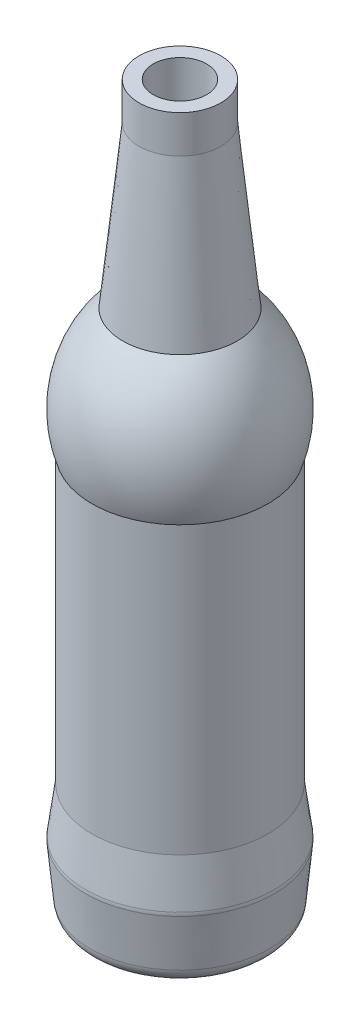
ISO-10303-21;
HEADER;
FILE_DESCRIPTION(('STEP AP214'),'2;1');
FILE_NAME('part.step','',(''),(''),'','','');
FILE_SCHEMA(('AUTOMOTIVE_DESIGN { 1 0 10303 214 1 1 1 1 }'));
ENDSEC;
DATA;
#1=APPLICATION_CONTEXT('core data for automotive mechanical design processes');
#2=APPLICATION_PROTOCOL_DEFINITION('international standard','automotive_design',2000,#1);
#3=PRODUCT_CONTEXT('',#1,'mechanical');
#4=PRODUCT('Part','Part','',(#3));
#5=PRODUCT_RELATED_PRODUCT_CATEGORY('part','',(#4));
#6=PRODUCT_DEFINITION_FORMATION('','',#4);
#7=PRODUCT_DEFINITION_CONTEXT('part definition',#1,'design');
#8=PRODUCT_DEFINITION('design','',#6,#7);
#9=PRODUCT_DEFINITION_SHAPE('','',#8);
#10=(LENGTH_UNIT() NAMED_UNIT(*) SI_UNIT(.MILLI.,.METRE.));
#11=(NAMED_UNIT(*) PLANE_ANGLE_UNIT() SI_UNIT($,.RADIAN.));
#12=(NAMED_UNIT(*) SI_UNIT($,.STERADIAN.) SOLID_ANGLE_UNIT());
#13=UNCERTAINTY_MEASURE_WITH_UNIT(LENGTH_MEASURE(1.E-05),#10,'distance_accuracy_value','');
#14=(GEOMETRIC_REPRESENTATION_CONTEXT(3) GLOBAL_UNCERTAINTY_ASSIGNED_CONTEXT((#13)) GLOBAL_UNIT_ASSIGNED_CONTEXT((#10,
#11,#12)) REPRESENTATION_CONTEXT('',''));
#15=CARTESIAN_POINT('',(0.,0.,0.));
#16=DIRECTION('',(0.,0.,1.));
#17=DIRECTION('',(1.,0.,0.));
#18=AXIS2_PLACEMENT_3D('',#15,#16,#17);
#19=CARTESIAN_POINT('',(0.,0.,0.));
#20=DIRECTION('',(0.,1.,0.));
#21=DIRECTION('',(0.,0.,1.));
#22=AXIS2_PLACEMENT_3D('',#19,#20,#21);
#23=PLANE('',#22);
#24=CARTESIAN_POINT('',(0.,0.,0.));
#25=DIRECTION('',(0.,-1.,0.));
#26=DIRECTION('',(0.,0.,-1.));
#27=AXIS2_PLACEMENT_3D('',#24,#25,#26);
#28=CIRCLE('',#27,23.453565926255);
#29=CARTESIAN_POINT('',(0.,0.,-23.453565926255));
#30=VERTEX_POINT('',#29);
#31=EDGE_CURVE('E10',#30,#30,#28,.T.);
#32=ORIENTED_EDGE('',*,*,#31,.T.);
#33=EDGE_LOOP('',(#32));
#34=FACE_BOUND('',#33,.T.);
#35=ADVANCED_FACE('F37',(#34),#23,.F.);
#36=CARTESIAN_POINT('',(0.,5.,0.));
#37=DIRECTION('',(0.,-1.,0.));
#38=DIRECTION('',(0.,0.,-1.));
#39=AXIS2_PLACEMENT_3D('',#36,#37,#38);
#40=TOROIDAL_SURFACE('',#39,23.453565926255,5.);
#41=ORIENTED_EDGE('',*,*,#31,.F.);
#42=EDGE_LOOP('',(#41));
#43=FACE_BOUND('',#42,.T.);
#44=CARTESIAN_POINT('',(0.,4.52595453686005,0.));
#45=DIRECTION('',(0.,-1.,0.));
#46=DIRECTION('',(0.,0.,-1.));
#47=AXIS2_PLACEMENT_3D('',#44,#45,#46);
#48=CIRCLE('',#47,28.4310432892248);
#49=CARTESIAN_POINT('',(0.,4.52595453686005,-28.4310432892248));
#50=VERTEX_POINT('',#49);
#51=EDGE_CURVE('E44',#50,#50,#48,.T.);
#52=ORIENTED_EDGE('',*,*,#51,.T.);
#53=EDGE_LOOP('',(#52));
#54=FACE_BOUND('',#53,.T.);
#55=ADVANCED_FACE('F129',(#43,#54),#40,.T.);
#56=CARTESIAN_POINT('',(0.,20.4313490984629,0.));
#57=DIRECTION('',(0.,1.,0.));
#58=DIRECTION('',(0.,0.,1.));
#59=AXIS2_PLACEMENT_3D('',#56,#57,#58);
#60=CONICAL_SURFACE('',#59,29.9458427712822,0.0949517063427563);
#61=ORIENTED_EDGE('',*,*,#51,.F.);
#62=EDGE_LOOP('',(#61));
#63=FACE_BOUND('',#62,.T.);
#64=CARTESIAN_POINT('',(0.,20.4313490984629,0.));
#65=DIRECTION('',(0.,-1.,0.));
#66=DIRECTION('',(0.,0.,-1.));
#67=AXIS2_PLACEMENT_3D('',#64,#65,#66);
#68=CIRCLE('',#67,29.9458427712822);
#69=CARTESIAN_POINT('',(0.,20.4313490984629,-29.9458427712822));
#70=VERTEX_POINT('',#69);
#71=EDGE_CURVE('E49',#70,#70,#68,.T.);
#72=ORIENTED_EDGE('',*,*,#71,.T.);
#73=EDGE_LOOP('',(#72));
#74=FACE_BOUND('',#73,.T.);
#75=ADVANCED_FACE('F133',(#63,#74),#60,.T.);
#76=CARTESIAN_POINT('',(0.,20.9053945616029,0.));
#77=DIRECTION('',(0.,-1.,0.));
#78=DIRECTION('',(0.,0.,-1.));
#79=AXIS2_PLACEMENT_3D('',#76,#77,#78);
#80=TOROIDAL_SURFACE('',#79,24.9683654083124,5.);
#81=ORIENTED_EDGE('',*,*,#71,.F.);
#82=EDGE_LOOP('',(#81));
#83=FACE_BOUND('',#82,.T.);
#84=CARTESIAN_POINT('',(0.,21.566213162058,0.));
#85=DIRECTION('',(0.,-1.,0.));
#86=DIRECTION('',(0.,0.,-1.));
#87=AXIS2_PLACEMENT_3D('',#84,#85,#86);
#88=CIRCLE('',#87,29.9245049117256);
#89=CARTESIAN_POINT('',(0.,21.566213162058,-29.9245049117256));
#90=VERTEX_POINT('',#89);
#91=EDGE_CURVE('E54',#90,#90,#88,.T.);
#92=ORIENTED_EDGE('',*,*,#91,.T.);
#93=EDGE_LOOP('',(#92));
#94=FACE_BOUND('',#93,.T.);
#95=ADVANCED_FACE('F138',(#83,#94),#80,.T.);
#96=CARTESIAN_POINT('',(0.,36.,0.));
#97=DIRECTION('',(0.,-1.,0.));
#98=DIRECTION('',(0.,0.,-1.));
#99=AXIS2_PLACEMENT_3D('',#96,#97,#98);
#100=CONICAL_SURFACE('',#99,28.,0.132551532296674);
#101=ORIENTED_EDGE('',*,*,#91,.F.);
#102=EDGE_LOOP('',(#101));
#103=FACE_BOUND('',#102,.T.);
#104=CARTESIAN_POINT('',(0.,36.,0.));
#105=DIRECTION('',(0.,-1.,0.));
#106=DIRECTION('',(0.,0.,-1.));
#107=AXIS2_PLACEMENT_3D('',#104,#105,#106);
#108=CIRCLE('',#107,28.);
#109=CARTESIAN_POINT('',(0.,36.,-28.));
#110=VERTEX_POINT('',#109);
#111=EDGE_CURVE('E60',#110,#110,#108,.T.);
#112=ORIENTED_EDGE('',*,*,#111,.T.);
#113=EDGE_LOOP('',(#112));
#114=FACE_BOUND('',#113,.T.);
#115=ADVANCED_FACE('F144',(#103,#114),#100,.T.);
#116=CARTESIAN_POINT('',(0.,0.,0.));
#117=DIRECTION('',(0.,-1.,0.));
#118=DIRECTION('',(0.,0.,-1.));
#119=AXIS2_PLACEMENT_3D('',#116,#117,#118);
#120=CYLINDRICAL_SURFACE('',#119,28.);
#121=ORIENTED_EDGE('',*,*,#111,.F.);
#122=EDGE_LOOP('',(#121));
#123=FACE_BOUND('',#122,.T.);
#124=CARTESIAN_POINT('',(0.,127.,0.));
#125=DIRECTION('',(0.,-1.,0.));
#126=DIRECTION('',(0.,0.,-1.));
#127=AXIS2_PLACEMENT_3D('',#124,#125,#126);
#128=CIRCLE('',#127,28.);
#129=CARTESIAN_POINT('',(0.,127.,-28.));
#130=VERTEX_POINT('',#129);
#131=EDGE_CURVE('E64',#130,#130,#128,.T.);
#132=ORIENTED_EDGE('',*,*,#131,.T.);
#133=EDGE_LOOP('',(#132));
#134=FACE_BOUND('',#133,.T.);
#135=ADVANCED_FACE('F148',(#123,#134),#120,.T.);
#136=CARTESIAN_POINT('',(0.,139.2650759235,0.));
#137=DIRECTION('',(0.,-1.,0.));
#138=DIRECTION('',(0.,0.,-1.));
#139=AXIS2_PLACEMENT_3D('',#136,#137,#138);
#140=DEGENERATE_TOROIDAL_SURFACE('',#139,8.60802185230658,38.6080218523066,.F.);
#141=ORIENTED_EDGE('',*,*,#131,.F.);
#142=EDGE_LOOP('',(#141));
#143=FACE_BOUND('',#142,.T.);
#144=CARTESIAN_POINT('',(0.,167.,0.));
#145=DIRECTION('',(0.,-1.,0.));
#146=DIRECTION('',(0.,0.,-1.));
#147=AXIS2_PLACEMENT_3D('',#144,#145,#146);
#148=CIRCLE('',#147,18.25);
#149=CARTESIAN_POINT('',(0.,167.,-18.25));
#150=VERTEX_POINT('',#149);
#151=EDGE_CURVE('E68',#150,#150,#148,.T.);
#152=ORIENTED_EDGE('',*,*,#151,.T.);
#153=EDGE_LOOP('',(#152));
#154=FACE_BOUND('',#153,.T.);
#155=ADVANCED_FACE('F152',(#143,#154),#140,.F.);
#156=CARTESIAN_POINT('',(0.,218.,0.));
#157=DIRECTION('',(0.,-1.,0.));
#158=DIRECTION('',(0.,0.,-1.));
#159=AXIS2_PLACEMENT_3D('',#156,#157,#158);
#160=CONICAL_SURFACE('',#159,13.,0.102579852418295);
#161=ORIENTED_EDGE('',*,*,#151,.F.);
#162=EDGE_LOOP('',(#161));
#163=FACE_BOUND('',#162,.T.);
#164=CARTESIAN_POINT('',(0.,218.,0.));
#165=DIRECTION('',(0.,-1.,0.));
#166=DIRECTION('',(0.,0.,-1.));
#167=AXIS2_PLACEMENT_3D('',#164,#165,#166);
#168=CIRCLE('',#167,13.);
#169=CARTESIAN_POINT('',(0.,218.,-13.));
#170=VERTEX_POINT('',#169);
#171=EDGE_CURVE('E72',#170,#170,#168,.T.);
#172=ORIENTED_EDGE('',*,*,#171,.T.);
#173=EDGE_LOOP('',(#172));
#174=FACE_BOUND('',#173,.T.);
#175=ADVANCED_FACE('F156',(#163,#174),#160,.T.);
#176=CARTESIAN_POINT('',(0.,0.,0.));
#177=DIRECTION('',(0.,-1.,0.));
#178=DIRECTION('',(0.,0.,-1.));
#179=AXIS2_PLACEMENT_3D('',#176,#177,#178);
#180=CYLINDRICAL_SURFACE('',#179,13.);
#181=ORIENTED_EDGE('',*,*,#171,.F.);
#182=EDGE_LOOP('',(#181));
#183=FACE_BOUND('',#182,.T.);
#184=CARTESIAN_POINT('',(0.,230.,0.));
#185=DIRECTION('',(0.,-1.,0.));
#186=DIRECTION('',(0.,0.,-1.));
#187=AXIS2_PLACEMENT_3D('',#184,#185,#186);
#188=CIRCLE('',#187,13.);
#189=CARTESIAN_POINT('',(0.,230.,-13.));
#190=VERTEX_POINT('',#189);
#191=EDGE_CURVE('E76',#190,#190,#188,.T.);
#192=ORIENTED_EDGE('',*,*,#191,.T.);
#193=EDGE_LOOP('',(#192));
#194=FACE_BOUND('',#193,.T.);
#195=ADVANCED_FACE('F160',(#183,#194),#180,.T.);
#196=CARTESIAN_POINT('',(-13.,230.,0.));
#197=DIRECTION('',(0.,-1.,0.));
#198=DIRECTION('',(0.,0.,-1.));
#199=AXIS2_PLACEMENT_3D('',#196,#197,#198);
#200=PLANE('',#199);
#201=ORIENTED_EDGE('',*,*,#191,.F.);
#202=EDGE_LOOP('',(#201));
#203=FACE_BOUND('',#202,.T.);
#204=CARTESIAN_POINT('',(0.,230.,0.));
#205=DIRECTION('',(0.,-1.,0.));
#206=DIRECTION('',(0.,0.,-1.));
#207=AXIS2_PLACEMENT_3D('',#204,#205,#206);
#208=CIRCLE('',#207,8.5);
#209=CARTESIAN_POINT('',(0.,230.,-8.5));
#210=VERTEX_POINT('',#209);
#211=EDGE_CURVE('E80',#210,#210,#208,.T.);
#212=ORIENTED_EDGE('',*,*,#211,.T.);
#213=EDGE_LOOP('',(#212));
#214=FACE_BOUND('',#213,.T.);
#215=ADVANCED_FACE('F164',(#203,#214),#200,.F.);
#216=CARTESIAN_POINT('',(0.,0.,0.));
#217=DIRECTION('',(0.,-1.,0.));
#218=DIRECTION('',(0.,0.,-1.));
#219=AXIS2_PLACEMENT_3D('',#216,#217,#218);
#220=CYLINDRICAL_SURFACE('',#219,8.5);
#221=ORIENTED_EDGE('',*,*,#211,.F.);
#222=EDGE_LOOP('',(#221));
#223=FACE_BOUND('',#222,.T.);
#224=CARTESIAN_POINT('',(0.,217.768992729596,0.));
#225=DIRECTION('',(0.,-1.,0.));
#226=DIRECTION('',(0.,0.,-1.));
#227=AXIS2_PLACEMENT_3D('',#224,#225,#226);
#228=CIRCLE('',#227,8.5);
#229=CARTESIAN_POINT('',(0.,217.768992729596,-8.5));
#230=VERTEX_POINT('',#229);
#231=EDGE_CURVE('E84',#230,#230,#228,.T.);
#232=ORIENTED_EDGE('',*,*,#231,.T.);
#233=EDGE_LOOP('',(#232));
#234=FACE_BOUND('',#233,.T.);
#235=ADVANCED_FACE('F168',(#223,#234),#220,.F.);
#236=CARTESIAN_POINT('',(0.,164.850328678312,0.));
#237=DIRECTION('',(0.,-1.,0.));
#238=DIRECTION('',(0.,0.,-1.));
#239=AXIS2_PLACEMENT_3D('',#236,#237,#238);
#240=CONICAL_SURFACE('',#239,13.947509534691,0.102579852418295);
#241=ORIENTED_EDGE('',*,*,#231,.F.);
#242=EDGE_LOOP('',(#241));
#243=FACE_BOUND('',#242,.T.);
#244=CARTESIAN_POINT('',(0.,164.850328678312,0.));
#245=DIRECTION('',(0.,-1.,0.));
#246=DIRECTION('',(0.,0.,-1.));
#247=AXIS2_PLACEMENT_3D('',#244,#245,#246);
#248=CIRCLE('',#247,13.947509534691);
#249=CARTESIAN_POINT('',(0.,164.850328678312,-13.947509534691));
#250=VERTEX_POINT('',#249);
#251=EDGE_CURVE('E88',#250,#250,#248,.T.);
#252=ORIENTED_EDGE('',*,*,#251,.T.);
#253=EDGE_LOOP('',(#252));
#254=FACE_BOUND('',#253,.T.);
#255=ADVANCED_FACE('F172',(#243,#254),#240,.F.);
#256=CARTESIAN_POINT('',(0.,139.2650759235,0.));
#257=DIRECTION('',(0.,-1.,0.));
#258=DIRECTION('',(0.,0.,-1.));
#259=AXIS2_PLACEMENT_3D('',#256,#257,#258);
#260=DEGENERATE_TOROIDAL_SURFACE('',#259,8.60802185230658,34.1080218523066,.F.);
#261=ORIENTED_EDGE('',*,*,#251,.F.);
#262=EDGE_LOOP('',(#261));
#263=FACE_BOUND('',#262,.T.);
#264=CARTESIAN_POINT('',(0.,127.757161802808,0.));
#265=DIRECTION('',(0.,-1.,0.));
#266=DIRECTION('',(0.,0.,-1.));
#267=AXIS2_PLACEMENT_3D('',#264,#265,#266);
#268=CIRCLE('',#267,23.5);
#269=CARTESIAN_POINT('',(0.,127.757161802808,-23.5));
#270=VERTEX_POINT('',#269);
#271=EDGE_CURVE('E92',#270,#270,#268,.T.);
#272=ORIENTED_EDGE('',*,*,#271,.T.);
#273=EDGE_LOOP('',(#272));
#274=FACE_BOUND('',#273,.T.);
#275=ADVANCED_FACE('F176',(#263,#274),#260,.T.);
#276=CARTESIAN_POINT('',(0.,0.,0.));
#277=DIRECTION('',(0.,-1.,0.));
#278=DIRECTION('',(0.,0.,-1.));
#279=AXIS2_PLACEMENT_3D('',#276,#277,#278);
#280=CYLINDRICAL_SURFACE('',#279,23.5);
#281=ORIENTED_EDGE('',*,*,#271,.F.);
#282=EDGE_LOOP('',(#281));
#283=FACE_BOUND('',#282,.T.);
#284=CARTESIAN_POINT('',(0.,35.7013216115515,0.));
#285=DIRECTION('',(0.,-1.,0.));
#286=DIRECTION('',(0.,0.,-1.));
#287=AXIS2_PLACEMENT_3D('',#284,#285,#286);
#288=CIRCLE('',#287,23.5);
#289=CARTESIAN_POINT('',(0.,35.7013216115515,-23.5));
#290=VERTEX_POINT('',#289);
#291=EDGE_CURVE('E96',#290,#290,#288,.T.);
#292=ORIENTED_EDGE('',*,*,#291,.T.);
#293=EDGE_LOOP('',(#292));
#294=FACE_BOUND('',#293,.T.);
#295=ADVANCED_FACE('F180',(#283,#294),#280,.F.);
#296=CARTESIAN_POINT('',(0.,20.9714764216484,0.));
#297=DIRECTION('',(0.,-1.,0.));
#298=DIRECTION('',(0.,0.,-1.));
#299=AXIS2_PLACEMENT_3D('',#296,#297,#298);
#300=CONICAL_SURFACE('',#299,25.4639793586537,0.132551532296674);
#301=ORIENTED_EDGE('',*,*,#291,.F.);
#302=EDGE_LOOP('',(#301));
#303=FACE_BOUND('',#302,.T.);
#304=CARTESIAN_POINT('',(0.,20.9714764216484,0.));
#305=DIRECTION('',(0.,-1.,0.));
#306=DIRECTION('',(0.,0.,-1.));
#307=AXIS2_PLACEMENT_3D('',#304,#305,#306);
#308=CIRCLE('',#307,25.4639793586537);
#309=CARTESIAN_POINT('',(0.,20.9714764216484,-25.4639793586537));
#310=VERTEX_POINT('',#309);
#311=EDGE_CURVE('E100',#310,#310,#308,.T.);
#312=ORIENTED_EDGE('',*,*,#311,.T.);
#313=EDGE_LOOP('',(#312));
#314=FACE_BOUND('',#313,.T.);
#315=ADVANCED_FACE('F184',(#303,#314),#300,.F.);
#316=CARTESIAN_POINT('',(0.,20.9053945616029,0.));
#317=DIRECTION('',(0.,-1.,0.));
#318=DIRECTION('',(0.,0.,-1.));
#319=AXIS2_PLACEMENT_3D('',#316,#317,#318);
#320=TOROIDAL_SURFACE('',#319,24.9683654083124,0.500000000000001);
#321=ORIENTED_EDGE('',*,*,#311,.F.);
#322=EDGE_LOOP('',(#321));
#323=FACE_BOUND('',#322,.T.);
#324=CARTESIAN_POINT('',(0.,20.8579900152889,0.));
#325=DIRECTION('',(0.,-1.,0.));
#326=DIRECTION('',(0.,0.,-1.));
#327=AXIS2_PLACEMENT_3D('',#324,#325,#326);
#328=CIRCLE('',#327,25.4661131446094);
#329=CARTESIAN_POINT('',(0.,20.8579900152889,-25.4661131446094));
#330=VERTEX_POINT('',#329);
#331=EDGE_CURVE('E104',#330,#330,#328,.T.);
#332=ORIENTED_EDGE('',*,*,#331,.T.);
#333=EDGE_LOOP('',(#332));
#334=FACE_BOUND('',#333,.T.);
#335=ADVANCED_FACE('F188',(#323,#334),#320,.F.);
#336=CARTESIAN_POINT('',(0.,4.952595453686,0.));
#337=DIRECTION('',(0.,1.,0.));
#338=DIRECTION('',(0.,0.,1.));
#339=AXIS2_PLACEMENT_3D('',#336,#337,#338);
#340=CONICAL_SURFACE('',#339,23.951313662552,0.0949517063427563);
#341=ORIENTED_EDGE('',*,*,#331,.F.);
#342=EDGE_LOOP('',(#341));
#343=FACE_BOUND('',#342,.T.);
#344=CARTESIAN_POINT('',(0.,4.952595453686,0.));
#345=DIRECTION('',(0.,-1.,0.));
#346=DIRECTION('',(0.,0.,-1.));
#347=AXIS2_PLACEMENT_3D('',#344,#345,#346);
#348=CIRCLE('',#347,23.951313662552);
#349=CARTESIAN_POINT('',(0.,4.952595453686,-23.951313662552));
#350=VERTEX_POINT('',#349);
#351=EDGE_CURVE('E108',#350,#350,#348,.T.);
#352=ORIENTED_EDGE('',*,*,#351,.T.);
#353=EDGE_LOOP('',(#352));
#354=FACE_BOUND('',#353,.T.);
#355=ADVANCED_FACE('F125',(#343,#354),#340,.F.);
#356=CARTESIAN_POINT('',(0.,5.,0.));
#357=DIRECTION('',(0.,-1.,0.));
#358=DIRECTION('',(0.,0.,-1.));
#359=AXIS2_PLACEMENT_3D('',#356,#357,#358);
#360=TOROIDAL_SURFACE('',#359,23.453565926255,0.499999999999998);
#361=ORIENTED_EDGE('',*,*,#351,.F.);
#362=EDGE_LOOP('',(#361));
#363=FACE_BOUND('',#362,.T.);
#364=CARTESIAN_POINT('',(0.,4.5,0.));
#365=DIRECTION('',(0.,-1.,0.));
#366=DIRECTION('',(0.,0.,-1.));
#367=AXIS2_PLACEMENT_3D('',#364,#365,#366);
#368=CIRCLE('',#367,23.453565926255);
#369=CARTESIAN_POINT('',(0.,4.5,-23.453565926255));
#370=VERTEX_POINT('',#369);
#371=EDGE_CURVE('E112',#370,#370,#368,.T.);
#372=ORIENTED_EDGE('',*,*,#371,.T.);
#373=EDGE_LOOP('',(#372));
#374=FACE_BOUND('',#373,.T.);
#375=ADVANCED_FACE('F117',(#363,#374),#360,.F.);
#376=CARTESIAN_POINT('',(0.,4.5,0.));
#377=DIRECTION('',(0.,-1.,0.));
#378=DIRECTION('',(0.,0.,-1.));
#379=AXIS2_PLACEMENT_3D('',#376,#377,#378);
#380=PLANE('',#379);
#381=ORIENTED_EDGE('',*,*,#371,.F.);
#382=EDGE_LOOP('',(#381));
#383=FACE_BOUND('',#382,.T.);
#384=ADVANCED_FACE('F119',(#383),#380,.F.);
#385=CLOSED_SHELL('',(#35,#55,#75,#95,#115,#135,#155,#175,#195,#215,#235,#255,#275,#295,#315,
#335,#355,#375,#384));
#386=MANIFOLD_SOLID_BREP('B2',#385);
#387=ADVANCED_BREP_SHAPE_REPRESENTATION('',(#18,#386),#14);
#388=SHAPE_DEFINITION_REPRESENTATION(#9,#387);
ENDSEC;
END-ISO-10303-21;
